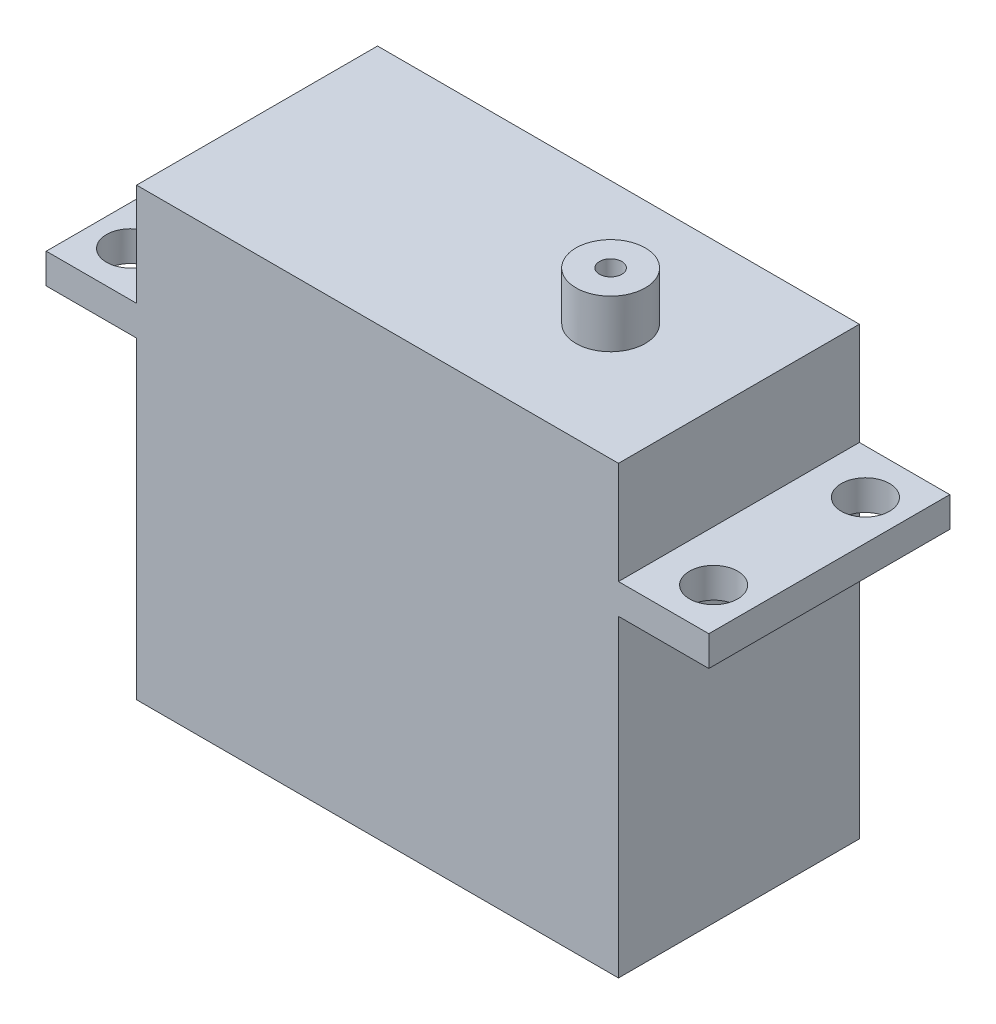
ISO-10303-21;
HEADER;
FILE_DESCRIPTION(('STEP AP214'),'2;1');
FILE_NAME('part.step','',(''),(''),'','','');
FILE_SCHEMA(('AUTOMOTIVE_DESIGN { 1 0 10303 214 1 1 1 1 }'));
ENDSEC;
DATA;
#1=APPLICATION_CONTEXT('core data for automotive mechanical design processes');
#2=APPLICATION_PROTOCOL_DEFINITION('international standard','automotive_design',2000,#1);
#3=PRODUCT_CONTEXT('',#1,'mechanical');
#4=PRODUCT('Part','Part','',(#3));
#5=PRODUCT_RELATED_PRODUCT_CATEGORY('part','',(#4));
#6=PRODUCT_DEFINITION_FORMATION('','',#4);
#7=PRODUCT_DEFINITION_CONTEXT('part definition',#1,'design');
#8=PRODUCT_DEFINITION('design','',#6,#7);
#9=PRODUCT_DEFINITION_SHAPE('','',#8);
#10=(LENGTH_UNIT() NAMED_UNIT(*) SI_UNIT(.MILLI.,.METRE.));
#11=(NAMED_UNIT(*) PLANE_ANGLE_UNIT() SI_UNIT($,.RADIAN.));
#12=(NAMED_UNIT(*) SI_UNIT($,.STERADIAN.) SOLID_ANGLE_UNIT());
#13=UNCERTAINTY_MEASURE_WITH_UNIT(LENGTH_MEASURE(1.E-05),#10,'distance_accuracy_value','');
#14=(GEOMETRIC_REPRESENTATION_CONTEXT(3) GLOBAL_UNCERTAINTY_ASSIGNED_CONTEXT((#13)) GLOBAL_UNIT_ASSIGNED_CONTEXT((#10,
#11,#12)) REPRESENTATION_CONTEXT('',''));
#15=CARTESIAN_POINT('',(0.,0.,0.));
#16=DIRECTION('',(0.,0.,1.));
#17=DIRECTION('',(1.,0.,0.));
#18=AXIS2_PLACEMENT_3D('',#15,#16,#17);
#19=CARTESIAN_POINT('',(-20.,37.,10.));
#20=DIRECTION('',(1.,0.,0.));
#21=DIRECTION('',(0.,0.,-1.));
#22=AXIS2_PLACEMENT_3D('',#19,#20,#21);
#23=PLANE('',#22);
#24=DIRECTION('',(0.,0.,-1.));
#25=VECTOR('',#24,1.);
#26=CARTESIAN_POINT('',(-20.,28.5,-10.));
#27=LINE('',#26,#25);
#28=CARTESIAN_POINT('',(-20.,28.5,10.));
#29=VERTEX_POINT('',#28);
#30=CARTESIAN_POINT('',(-20.,28.5,-10.));
#31=VERTEX_POINT('',#30);
#32=EDGE_CURVE('E176',#29,#31,#27,.T.);
#33=ORIENTED_EDGE('',*,*,#32,.F.);
#34=DIRECTION('',(0.,-1.,0.));
#35=VECTOR('',#34,1.);
#36=CARTESIAN_POINT('',(-20.,37.,10.));
#37=LINE('',#36,#35);
#38=CARTESIAN_POINT('',(-20.,37.,10.));
#39=VERTEX_POINT('',#38);
#40=EDGE_CURVE('E276',#39,#29,#37,.T.);
#41=ORIENTED_EDGE('',*,*,#40,.F.);
#42=DIRECTION('',(0.,0.,1.));
#43=VECTOR('',#42,1.);
#44=CARTESIAN_POINT('',(-20.,37.,10.));
#45=LINE('',#44,#43);
#46=CARTESIAN_POINT('',(-20.,37.,-10.));
#47=VERTEX_POINT('',#46);
#48=EDGE_CURVE('E253',#47,#39,#45,.T.);
#49=ORIENTED_EDGE('',*,*,#48,.F.);
#50=DIRECTION('',(0.,-1.,0.));
#51=VECTOR('',#50,1.);
#52=CARTESIAN_POINT('',(-20.,37.,-10.));
#53=LINE('',#52,#51);
#54=EDGE_CURVE('E281',#47,#31,#53,.T.);
#55=ORIENTED_EDGE('',*,*,#54,.T.);
#56=EDGE_LOOP('',(#33,#41,#49,#55));
#57=FACE_BOUND('',#56,.T.);
#58=ADVANCED_FACE('F39',(#57),#23,.F.);
#59=CARTESIAN_POINT('',(20.,37.,10.));
#60=DIRECTION('',(-1.,0.,0.));
#61=DIRECTION('',(0.,0.,1.));
#62=AXIS2_PLACEMENT_3D('',#59,#60,#61);
#63=PLANE('',#62);
#64=DIRECTION('',(0.,0.,1.));
#65=VECTOR('',#64,1.);
#66=CARTESIAN_POINT('',(20.,28.5,-10.));
#67=LINE('',#66,#65);
#68=CARTESIAN_POINT('',(20.,28.5,-10.));
#69=VERTEX_POINT('',#68);
#70=CARTESIAN_POINT('',(20.,28.5,10.));
#71=VERTEX_POINT('',#70);
#72=EDGE_CURVE('E210',#69,#71,#67,.T.);
#73=ORIENTED_EDGE('',*,*,#72,.F.);
#74=DIRECTION('',(0.,-1.,0.));
#75=VECTOR('',#74,1.);
#76=CARTESIAN_POINT('',(20.,37.,-10.));
#77=LINE('',#76,#75);
#78=CARTESIAN_POINT('',(20.,37.,-10.));
#79=VERTEX_POINT('',#78);
#80=EDGE_CURVE('E48',#79,#69,#77,.T.);
#81=ORIENTED_EDGE('',*,*,#80,.F.);
#82=DIRECTION('',(0.,0.,-1.));
#83=VECTOR('',#82,1.);
#84=CARTESIAN_POINT('',(20.,37.,10.));
#85=LINE('',#84,#83);
#86=CARTESIAN_POINT('',(20.,37.,10.));
#87=VERTEX_POINT('',#86);
#88=EDGE_CURVE('E245',#87,#79,#85,.T.);
#89=ORIENTED_EDGE('',*,*,#88,.F.);
#90=DIRECTION('',(0.,-1.,0.));
#91=VECTOR('',#90,1.);
#92=CARTESIAN_POINT('',(20.,37.,10.));
#93=LINE('',#92,#91);
#94=EDGE_CURVE('E273',#87,#71,#93,.T.);
#95=ORIENTED_EDGE('',*,*,#94,.T.);
#96=EDGE_LOOP('',(#73,#81,#89,#95));
#97=FACE_BOUND('',#96,.T.);
#98=ADVANCED_FACE('F328',(#97),#63,.F.);
#99=CARTESIAN_POINT('',(20.,26.,-10.));
#100=VERTEX_POINT('',#99);
#101=CARTESIAN_POINT('',(20.,0.,-10.));
#102=VERTEX_POINT('',#101);
#103=EDGE_CURVE('E284',#100,#102,#77,.T.);
#104=ORIENTED_EDGE('',*,*,#103,.F.);
#105=DIRECTION('',(0.,0.,1.));
#106=VECTOR('',#105,1.);
#107=CARTESIAN_POINT('',(20.,26.,-10.));
#108=LINE('',#107,#106);
#109=CARTESIAN_POINT('',(20.,26.,10.));
#110=VERTEX_POINT('',#109);
#111=EDGE_CURVE('E209',#100,#110,#108,.T.);
#112=ORIENTED_EDGE('',*,*,#111,.T.);
#113=CARTESIAN_POINT('',(20.,0.,10.));
#114=VERTEX_POINT('',#113);
#115=EDGE_CURVE('E259',#110,#114,#93,.T.);
#116=ORIENTED_EDGE('',*,*,#115,.T.);
#117=DIRECTION('',(0.,0.,-1.));
#118=VECTOR('',#117,1.);
#119=CARTESIAN_POINT('',(20.,0.,10.));
#120=LINE('',#119,#118);
#121=EDGE_CURVE('E244',#114,#102,#120,.T.);
#122=ORIENTED_EDGE('',*,*,#121,.T.);
#123=EDGE_LOOP('',(#104,#112,#116,#122));
#124=FACE_BOUND('',#123,.T.);
#125=ADVANCED_FACE('F41',(#124),#63,.F.);
#126=CARTESIAN_POINT('',(-20.,37.,-10.));
#127=DIRECTION('',(0.,0.,1.));
#128=DIRECTION('',(1.,0.,0.));
#129=AXIS2_PLACEMENT_3D('',#126,#127,#128);
#130=PLANE('',#129);
#131=DIRECTION('',(-1.,0.,0.));
#132=VECTOR('',#131,1.);
#133=CARTESIAN_POINT('',(-20.,0.,-10.));
#134=LINE('',#133,#132);
#135=CARTESIAN_POINT('',(-20.,0.,-10.));
#136=VERTEX_POINT('',#135);
#137=EDGE_CURVE('E263',#102,#136,#134,.T.);
#138=ORIENTED_EDGE('',*,*,#137,.T.);
#139=CARTESIAN_POINT('',(-20.,26.,-10.));
#140=VERTEX_POINT('',#139);
#141=EDGE_CURVE('E280',#140,#136,#53,.T.);
#142=ORIENTED_EDGE('',*,*,#141,.F.);
#143=DIRECTION('',(-1.,0.,0.));
#144=VECTOR('',#143,1.);
#145=CARTESIAN_POINT('',(-20.,26.,-10.));
#146=LINE('',#145,#144);
#147=CARTESIAN_POINT('',(-27.5,26.,-10.));
#148=VERTEX_POINT('',#147);
#149=EDGE_CURVE('E194',#140,#148,#146,.T.);
#150=ORIENTED_EDGE('',*,*,#149,.T.);
#151=DIRECTION('',(0.,-1.,0.));
#152=VECTOR('',#151,1.);
#153=CARTESIAN_POINT('',(-27.5,28.5,-10.));
#154=LINE('',#153,#152);
#155=CARTESIAN_POINT('',(-27.5,28.5,-10.));
#156=VERTEX_POINT('',#155);
#157=EDGE_CURVE('E205',#156,#148,#154,.T.);
#158=ORIENTED_EDGE('',*,*,#157,.F.);
#159=DIRECTION('',(-1.,0.,0.));
#160=VECTOR('',#159,1.);
#161=CARTESIAN_POINT('',(-20.,28.5,-10.));
#162=LINE('',#161,#160);
#163=EDGE_CURVE('E180',#31,#156,#162,.T.);
#164=ORIENTED_EDGE('',*,*,#163,.F.);
#165=ORIENTED_EDGE('',*,*,#54,.F.);
#166=DIRECTION('',(-1.,0.,0.));
#167=VECTOR('',#166,1.);
#168=CARTESIAN_POINT('',(-20.,37.,-10.));
#169=LINE('',#168,#167);
#170=EDGE_CURVE('E249',#79,#47,#169,.T.);
#171=ORIENTED_EDGE('',*,*,#170,.F.);
#172=ORIENTED_EDGE('',*,*,#80,.T.);
#173=DIRECTION('',(-1.,0.,0.));
#174=VECTOR('',#173,1.);
#175=CARTESIAN_POINT('',(20.,28.5,-10.));
#176=LINE('',#175,#174);
#177=CARTESIAN_POINT('',(27.5,28.5,-10.));
#178=VERTEX_POINT('',#177);
#179=EDGE_CURVE('E221',#178,#69,#176,.T.);
#180=ORIENTED_EDGE('',*,*,#179,.F.);
#181=DIRECTION('',(0.,-1.,0.));
#182=VECTOR('',#181,1.);
#183=CARTESIAN_POINT('',(27.5,28.5,-10.));
#184=LINE('',#183,#182);
#185=CARTESIAN_POINT('',(27.5,26.,-10.));
#186=VERTEX_POINT('',#185);
#187=EDGE_CURVE('E225',#178,#186,#184,.T.);
#188=ORIENTED_EDGE('',*,*,#187,.T.);
#189=DIRECTION('',(-1.,0.,0.));
#190=VECTOR('',#189,1.);
#191=CARTESIAN_POINT('',(20.,26.,-10.));
#192=LINE('',#191,#190);
#193=EDGE_CURVE('E215',#186,#100,#192,.T.);
#194=ORIENTED_EDGE('',*,*,#193,.T.);
#195=ORIENTED_EDGE('',*,*,#103,.T.);
#196=EDGE_LOOP('',(#138,#142,#150,#158,#164,#165,#171,#172,#180,#188,#194,#195));
#197=FACE_BOUND('',#196,.T.);
#198=ADVANCED_FACE('F309',(#197),#130,.F.);
#199=CARTESIAN_POINT('',(-20.,26.,10.));
#200=VERTEX_POINT('',#199);
#201=CARTESIAN_POINT('',(-20.,0.,10.));
#202=VERTEX_POINT('',#201);
#203=EDGE_CURVE('E60',#200,#202,#37,.T.);
#204=ORIENTED_EDGE('',*,*,#203,.F.);
#205=DIRECTION('',(0.,0.,-1.));
#206=VECTOR('',#205,1.);
#207=CARTESIAN_POINT('',(-20.,26.,-10.));
#208=LINE('',#207,#206);
#209=EDGE_CURVE('E55',#200,#140,#208,.T.);
#210=ORIENTED_EDGE('',*,*,#209,.T.);
#211=ORIENTED_EDGE('',*,*,#141,.T.);
#212=DIRECTION('',(0.,0.,1.));
#213=VECTOR('',#212,1.);
#214=CARTESIAN_POINT('',(-20.,0.,10.));
#215=LINE('',#214,#213);
#216=EDGE_CURVE('E267',#136,#202,#215,.T.);
#217=ORIENTED_EDGE('',*,*,#216,.T.);
#218=EDGE_LOOP('',(#204,#210,#211,#217));
#219=FACE_BOUND('',#218,.T.);
#220=ADVANCED_FACE('F358',(#219),#23,.F.);
#221=CARTESIAN_POINT('',(-20.,37.,10.));
#222=DIRECTION('',(0.,0.,-1.));
#223=DIRECTION('',(-1.,0.,0.));
#224=AXIS2_PLACEMENT_3D('',#221,#222,#223);
#225=PLANE('',#224);
#226=DIRECTION('',(1.,0.,0.));
#227=VECTOR('',#226,1.);
#228=CARTESIAN_POINT('',(-20.,0.,10.));
#229=LINE('',#228,#227);
#230=EDGE_CURVE('E250',#202,#114,#229,.T.);
#231=ORIENTED_EDGE('',*,*,#230,.T.);
#232=ORIENTED_EDGE('',*,*,#115,.F.);
#233=DIRECTION('',(1.,0.,0.));
#234=VECTOR('',#233,1.);
#235=CARTESIAN_POINT('',(20.,26.,10.));
#236=LINE('',#235,#234);
#237=CARTESIAN_POINT('',(27.5,26.,10.));
#238=VERTEX_POINT('',#237);
#239=EDGE_CURVE('E228',#110,#238,#236,.T.);
#240=ORIENTED_EDGE('',*,*,#239,.T.);
#241=DIRECTION('',(0.,-1.,0.));
#242=VECTOR('',#241,1.);
#243=CARTESIAN_POINT('',(27.5,28.5,10.));
#244=LINE('',#243,#242);
#245=CARTESIAN_POINT('',(27.5,28.5,10.));
#246=VERTEX_POINT('',#245);
#247=EDGE_CURVE('E240',#246,#238,#244,.T.);
#248=ORIENTED_EDGE('',*,*,#247,.F.);
#249=DIRECTION('',(1.,0.,0.));
#250=VECTOR('',#249,1.);
#251=CARTESIAN_POINT('',(20.,28.5,10.));
#252=LINE('',#251,#250);
#253=EDGE_CURVE('E214',#71,#246,#252,.T.);
#254=ORIENTED_EDGE('',*,*,#253,.F.);
#255=ORIENTED_EDGE('',*,*,#94,.F.);
#256=DIRECTION('',(1.,0.,0.));
#257=VECTOR('',#256,1.);
#258=CARTESIAN_POINT('',(-20.,37.,10.));
#259=LINE('',#258,#257);
#260=EDGE_CURVE('E256',#39,#87,#259,.T.);
#261=ORIENTED_EDGE('',*,*,#260,.F.);
#262=ORIENTED_EDGE('',*,*,#40,.T.);
#263=DIRECTION('',(1.,0.,0.));
#264=VECTOR('',#263,1.);
#265=CARTESIAN_POINT('',(-20.,28.5,10.));
#266=LINE('',#265,#264);
#267=CARTESIAN_POINT('',(-27.5,28.5,10.));
#268=VERTEX_POINT('',#267);
#269=EDGE_CURVE('E187',#268,#29,#266,.T.);
#270=ORIENTED_EDGE('',*,*,#269,.F.);
#271=DIRECTION('',(0.,-1.,0.));
#272=VECTOR('',#271,1.);
#273=CARTESIAN_POINT('',(-27.5,28.5,10.));
#274=LINE('',#273,#272);
#275=CARTESIAN_POINT('',(-27.5,26.,10.));
#276=VERTEX_POINT('',#275);
#277=EDGE_CURVE('E191',#268,#276,#274,.T.);
#278=ORIENTED_EDGE('',*,*,#277,.T.);
#279=DIRECTION('',(1.,0.,0.));
#280=VECTOR('',#279,1.);
#281=CARTESIAN_POINT('',(-20.,26.,10.));
#282=LINE('',#281,#280);
#283=EDGE_CURVE('E181',#276,#200,#282,.T.);
#284=ORIENTED_EDGE('',*,*,#283,.T.);
#285=ORIENTED_EDGE('',*,*,#203,.T.);
#286=EDGE_LOOP('',(#231,#232,#240,#248,#254,#255,#261,#262,#270,#278,#284,#285));
#287=FACE_BOUND('',#286,.T.);
#288=ADVANCED_FACE('F347',(#287),#225,.F.);
#289=CARTESIAN_POINT('',(0.,37.,0.));
#290=DIRECTION('',(0.,-1.,0.));
#291=DIRECTION('',(0.,0.,-1.));
#292=AXIS2_PLACEMENT_3D('',#289,#290,#291);
#293=PLANE('',#292);
#294=CARTESIAN_POINT('',(9.62499999999999,37.,0.275000000000001));
#295=DIRECTION('',(0.,-1.,0.));
#296=DIRECTION('',(0.,0.,-1.));
#297=AXIS2_PLACEMENT_3D('',#294,#295,#296);
#298=CIRCLE('',#297,2.875);
#299=CARTESIAN_POINT('',(9.62499999999999,37.,-2.6));
#300=VERTEX_POINT('',#299);
#301=EDGE_CURVE('E11',#300,#300,#298,.F.);
#302=ORIENTED_EDGE('',*,*,#301,.F.);
#303=EDGE_LOOP('',(#302));
#304=FACE_BOUND('',#303,.T.);
#305=ORIENTED_EDGE('',*,*,#88,.T.);
#306=ORIENTED_EDGE('',*,*,#170,.T.);
#307=ORIENTED_EDGE('',*,*,#48,.T.);
#308=ORIENTED_EDGE('',*,*,#260,.T.);
#309=EDGE_LOOP('',(#305,#306,#307,#308));
#310=FACE_BOUND('',#309,.T.);
#311=ADVANCED_FACE('F323',(#304,#310),#293,.F.);
#312=CARTESIAN_POINT('',(0.,0.,0.));
#313=DIRECTION('',(0.,-1.,0.));
#314=DIRECTION('',(0.,0.,-1.));
#315=AXIS2_PLACEMENT_3D('',#312,#313,#314);
#316=PLANE('',#315);
#317=ORIENTED_EDGE('',*,*,#121,.F.);
#318=ORIENTED_EDGE('',*,*,#230,.F.);
#319=ORIENTED_EDGE('',*,*,#216,.F.);
#320=ORIENTED_EDGE('',*,*,#137,.F.);
#321=EDGE_LOOP('',(#317,#318,#319,#320));
#322=FACE_BOUND('',#321,.T.);
#323=ADVANCED_FACE('F357',(#322),#316,.T.);
#324=CARTESIAN_POINT('',(27.5,28.5,-10.));
#325=DIRECTION('',(-1.,0.,0.));
#326=DIRECTION('',(0.,0.,1.));
#327=AXIS2_PLACEMENT_3D('',#324,#325,#326);
#328=PLANE('',#327);
#329=DIRECTION('',(0.,0.,-1.));
#330=VECTOR('',#329,1.);
#331=CARTESIAN_POINT('',(27.5,26.,-10.));
#332=LINE('',#331,#330);
#333=EDGE_CURVE('E231',#238,#186,#332,.T.);
#334=ORIENTED_EDGE('',*,*,#333,.T.);
#335=ORIENTED_EDGE('',*,*,#187,.F.);
#336=DIRECTION('',(0.,0.,-1.));
#337=VECTOR('',#336,1.);
#338=CARTESIAN_POINT('',(27.5,28.5,-10.));
#339=LINE('',#338,#337);
#340=EDGE_CURVE('E218',#246,#178,#339,.T.);
#341=ORIENTED_EDGE('',*,*,#340,.F.);
#342=ORIENTED_EDGE('',*,*,#247,.T.);
#343=EDGE_LOOP('',(#334,#335,#341,#342));
#344=FACE_BOUND('',#343,.T.);
#345=ADVANCED_FACE('F337',(#344),#328,.F.);
#346=CARTESIAN_POINT('',(0.,28.5,0.));
#347=DIRECTION('',(0.,1.,0.));
#348=DIRECTION('',(0.,0.,1.));
#349=AXIS2_PLACEMENT_3D('',#346,#347,#348);
#350=PLANE('',#349);
#351=CARTESIAN_POINT('',(24.2,28.5,-6.3));
#352=DIRECTION('',(0.,1.,0.));
#353=DIRECTION('',(0.,0.,1.));
#354=AXIS2_PLACEMENT_3D('',#351,#352,#353);
#355=CIRCLE('',#354,2.);
#356=CARTESIAN_POINT('',(24.2,28.5,-4.3));
#357=VERTEX_POINT('',#356);
#358=EDGE_CURVE('E163',#357,#357,#355,.T.);
#359=ORIENTED_EDGE('',*,*,#358,.F.);
#360=EDGE_LOOP('',(#359));
#361=FACE_BOUND('',#360,.T.);
#362=CARTESIAN_POINT('',(24.2,28.5,6.3));
#363=DIRECTION('',(0.,1.,0.));
#364=DIRECTION('',(0.,0.,1.));
#365=AXIS2_PLACEMENT_3D('',#362,#363,#364);
#366=CIRCLE('',#365,2.);
#367=CARTESIAN_POINT('',(24.2,28.5,8.3));
#368=VERTEX_POINT('',#367);
#369=EDGE_CURVE('E171',#368,#368,#366,.T.);
#370=ORIENTED_EDGE('',*,*,#369,.F.);
#371=EDGE_LOOP('',(#370));
#372=FACE_BOUND('',#371,.T.);
#373=ORIENTED_EDGE('',*,*,#72,.T.);
#374=ORIENTED_EDGE('',*,*,#253,.T.);
#375=ORIENTED_EDGE('',*,*,#340,.T.);
#376=ORIENTED_EDGE('',*,*,#179,.T.);
#377=EDGE_LOOP('',(#373,#374,#375,#376));
#378=FACE_BOUND('',#377,.T.);
#379=ADVANCED_FACE('F331',(#361,#372,#378),#350,.T.);
#380=CARTESIAN_POINT('',(0.,26.,0.));
#381=DIRECTION('',(0.,1.,0.));
#382=DIRECTION('',(0.,0.,1.));
#383=AXIS2_PLACEMENT_3D('',#380,#381,#382);
#384=PLANE('',#383);
#385=CARTESIAN_POINT('',(24.2,26.,-6.3));
#386=DIRECTION('',(0.,1.,0.));
#387=DIRECTION('',(0.,0.,1.));
#388=AXIS2_PLACEMENT_3D('',#385,#386,#387);
#389=CIRCLE('',#388,2.);
#390=CARTESIAN_POINT('',(24.2,26.,-4.3));
#391=VERTEX_POINT('',#390);
#392=EDGE_CURVE('E167',#391,#391,#389,.T.);
#393=ORIENTED_EDGE('',*,*,#392,.T.);
#394=EDGE_LOOP('',(#393));
#395=FACE_BOUND('',#394,.T.);
#396=CARTESIAN_POINT('',(24.2,26.,6.3));
#397=DIRECTION('',(0.,1.,0.));
#398=DIRECTION('',(0.,0.,1.));
#399=AXIS2_PLACEMENT_3D('',#396,#397,#398);
#400=CIRCLE('',#399,2.);
#401=CARTESIAN_POINT('',(24.2,26.,8.3));
#402=VERTEX_POINT('',#401);
#403=EDGE_CURVE('E175',#402,#402,#400,.T.);
#404=ORIENTED_EDGE('',*,*,#403,.T.);
#405=EDGE_LOOP('',(#404));
#406=FACE_BOUND('',#405,.T.);
#407=ORIENTED_EDGE('',*,*,#111,.F.);
#408=ORIENTED_EDGE('',*,*,#193,.F.);
#409=ORIENTED_EDGE('',*,*,#333,.F.);
#410=ORIENTED_EDGE('',*,*,#239,.F.);
#411=EDGE_LOOP('',(#407,#408,#409,#410));
#412=FACE_BOUND('',#411,.T.);
#413=ADVANCED_FACE('F342',(#395,#406,#412),#384,.F.);
#414=CARTESIAN_POINT('',(-27.5,28.5,-10.));
#415=DIRECTION('',(1.,0.,0.));
#416=DIRECTION('',(0.,0.,-1.));
#417=AXIS2_PLACEMENT_3D('',#414,#415,#416);
#418=PLANE('',#417);
#419=DIRECTION('',(0.,0.,1.));
#420=VECTOR('',#419,1.);
#421=CARTESIAN_POINT('',(-27.5,26.,-10.));
#422=LINE('',#421,#420);
#423=EDGE_CURVE('E197',#148,#276,#422,.T.);
#424=ORIENTED_EDGE('',*,*,#423,.T.);
#425=ORIENTED_EDGE('',*,*,#277,.F.);
#426=DIRECTION('',(0.,0.,1.));
#427=VECTOR('',#426,1.);
#428=CARTESIAN_POINT('',(-27.5,28.5,-10.));
#429=LINE('',#428,#427);
#430=EDGE_CURVE('E184',#156,#268,#429,.T.);
#431=ORIENTED_EDGE('',*,*,#430,.F.);
#432=ORIENTED_EDGE('',*,*,#157,.T.);
#433=EDGE_LOOP('',(#424,#425,#431,#432));
#434=FACE_BOUND('',#433,.T.);
#435=ADVANCED_FACE('F313',(#434),#418,.F.);
#436=CARTESIAN_POINT('',(0.,28.5,0.));
#437=DIRECTION('',(0.,-1.,0.));
#438=DIRECTION('',(0.,0.,-1.));
#439=AXIS2_PLACEMENT_3D('',#436,#437,#438);
#440=PLANE('',#439);
#441=CARTESIAN_POINT('',(-24.2,28.5,6.3));
#442=DIRECTION('',(0.,1.,0.));
#443=DIRECTION('',(0.,0.,1.));
#444=AXIS2_PLACEMENT_3D('',#441,#442,#443);
#445=CIRCLE('',#444,2.);
#446=CARTESIAN_POINT('',(-24.2,28.5,8.3));
#447=VERTEX_POINT('',#446);
#448=EDGE_CURVE('E146',#447,#447,#445,.T.);
#449=ORIENTED_EDGE('',*,*,#448,.F.);
#450=EDGE_LOOP('',(#449));
#451=FACE_BOUND('',#450,.T.);
#452=CARTESIAN_POINT('',(-24.2,28.5,-6.3));
#453=DIRECTION('',(0.,1.,0.));
#454=DIRECTION('',(0.,0.,1.));
#455=AXIS2_PLACEMENT_3D('',#452,#453,#454);
#456=CIRCLE('',#455,2.);
#457=CARTESIAN_POINT('',(-24.2,28.5,-4.3));
#458=VERTEX_POINT('',#457);
#459=EDGE_CURVE('E158',#458,#458,#456,.T.);
#460=ORIENTED_EDGE('',*,*,#459,.F.);
#461=EDGE_LOOP('',(#460));
#462=FACE_BOUND('',#461,.T.);
#463=ORIENTED_EDGE('',*,*,#32,.T.);
#464=ORIENTED_EDGE('',*,*,#163,.T.);
#465=ORIENTED_EDGE('',*,*,#430,.T.);
#466=ORIENTED_EDGE('',*,*,#269,.T.);
#467=EDGE_LOOP('',(#463,#464,#465,#466));
#468=FACE_BOUND('',#467,.T.);
#469=ADVANCED_FACE('F301',(#451,#462,#468),#440,.F.);
#470=CARTESIAN_POINT('',(0.,26.,0.));
#471=DIRECTION('',(0.,-1.,0.));
#472=DIRECTION('',(0.,0.,-1.));
#473=AXIS2_PLACEMENT_3D('',#470,#471,#472);
#474=PLANE('',#473);
#475=CARTESIAN_POINT('',(-24.2,26.,6.3));
#476=DIRECTION('',(0.,-1.,0.));
#477=DIRECTION('',(0.,0.,-1.));
#478=AXIS2_PLACEMENT_3D('',#475,#476,#477);
#479=CIRCLE('',#478,2.);
#480=CARTESIAN_POINT('',(-24.2,26.,4.3));
#481=VERTEX_POINT('',#480);
#482=EDGE_CURVE('E154',#481,#481,#479,.T.);
#483=ORIENTED_EDGE('',*,*,#482,.F.);
#484=EDGE_LOOP('',(#483));
#485=FACE_BOUND('',#484,.T.);
#486=CARTESIAN_POINT('',(-24.2,26.,-6.3));
#487=DIRECTION('',(0.,-1.,0.));
#488=DIRECTION('',(0.,0.,-1.));
#489=AXIS2_PLACEMENT_3D('',#486,#487,#488);
#490=CIRCLE('',#489,2.);
#491=CARTESIAN_POINT('',(-24.2,26.,-8.3));
#492=VERTEX_POINT('',#491);
#493=EDGE_CURVE('E162',#492,#492,#490,.T.);
#494=ORIENTED_EDGE('',*,*,#493,.F.);
#495=EDGE_LOOP('',(#494));
#496=FACE_BOUND('',#495,.T.);
#497=ORIENTED_EDGE('',*,*,#209,.F.);
#498=ORIENTED_EDGE('',*,*,#283,.F.);
#499=ORIENTED_EDGE('',*,*,#423,.F.);
#500=ORIENTED_EDGE('',*,*,#149,.F.);
#501=EDGE_LOOP('',(#497,#498,#499,#500));
#502=FACE_BOUND('',#501,.T.);
#503=ADVANCED_FACE('F297',(#485,#496,#502),#474,.T.);
#504=CARTESIAN_POINT('',(24.2,28.5,6.3));
#505=DIRECTION('',(0.,1.,0.));
#506=DIRECTION('',(0.,0.,1.));
#507=AXIS2_PLACEMENT_3D('',#504,#505,#506);
#508=CYLINDRICAL_SURFACE('',#507,2.);
#509=ORIENTED_EDGE('',*,*,#369,.T.);
#510=EDGE_LOOP('',(#509));
#511=FACE_BOUND('',#510,.T.);
#512=ORIENTED_EDGE('',*,*,#403,.F.);
#513=EDGE_LOOP('',(#512));
#514=FACE_BOUND('',#513,.T.);
#515=ADVANCED_FACE('F300',(#511,#514),#508,.F.);
#516=CARTESIAN_POINT('',(24.2,28.5,-6.3));
#517=DIRECTION('',(0.,1.,0.));
#518=DIRECTION('',(0.,0.,1.));
#519=AXIS2_PLACEMENT_3D('',#516,#517,#518);
#520=CYLINDRICAL_SURFACE('',#519,2.);
#521=ORIENTED_EDGE('',*,*,#358,.T.);
#522=EDGE_LOOP('',(#521));
#523=FACE_BOUND('',#522,.T.);
#524=ORIENTED_EDGE('',*,*,#392,.F.);
#525=EDGE_LOOP('',(#524));
#526=FACE_BOUND('',#525,.T.);
#527=ADVANCED_FACE('F453',(#523,#526),#520,.F.);
#528=CARTESIAN_POINT('',(-24.2,28.5,-6.3));
#529=DIRECTION('',(0.,1.,0.));
#530=DIRECTION('',(0.,0.,1.));
#531=AXIS2_PLACEMENT_3D('',#528,#529,#530);
#532=CYLINDRICAL_SURFACE('',#531,2.);
#533=ORIENTED_EDGE('',*,*,#493,.T.);
#534=EDGE_LOOP('',(#533));
#535=FACE_BOUND('',#534,.T.);
#536=ORIENTED_EDGE('',*,*,#459,.T.);
#537=EDGE_LOOP('',(#536));
#538=FACE_BOUND('',#537,.T.);
#539=ADVANCED_FACE('F294',(#535,#538),#532,.F.);
#540=CARTESIAN_POINT('',(-24.2,28.5,6.3));
#541=DIRECTION('',(0.,1.,0.));
#542=DIRECTION('',(0.,0.,1.));
#543=AXIS2_PLACEMENT_3D('',#540,#541,#542);
#544=CYLINDRICAL_SURFACE('',#543,2.);
#545=ORIENTED_EDGE('',*,*,#482,.T.);
#546=EDGE_LOOP('',(#545));
#547=FACE_BOUND('',#546,.T.);
#548=ORIENTED_EDGE('',*,*,#448,.T.);
#549=EDGE_LOOP('',(#548));
#550=FACE_BOUND('',#549,.T.);
#551=ADVANCED_FACE('F472',(#547,#550),#544,.F.);
#552=CARTESIAN_POINT('',(9.62499999999999,41.,0.275000000000001));
#553=DIRECTION('',(0.,-1.,0.));
#554=DIRECTION('',(0.,0.,-1.));
#555=AXIS2_PLACEMENT_3D('',#552,#553,#554);
#556=CYLINDRICAL_SURFACE('',#555,2.875);
#557=CARTESIAN_POINT('',(9.62499999999999,41.,0.275000000000001));
#558=DIRECTION('',(0.,1.,0.));
#559=DIRECTION('',(0.,0.,1.));
#560=AXIS2_PLACEMENT_3D('',#557,#558,#559);
#561=CIRCLE('',#560,2.875);
#562=CARTESIAN_POINT('',(9.62499999999999,41.,3.15));
#563=VERTEX_POINT('',#562);
#564=EDGE_CURVE('E140',#563,#563,#561,.T.);
#565=ORIENTED_EDGE('',*,*,#564,.F.);
#566=EDGE_LOOP('',(#565));
#567=FACE_BOUND('',#566,.T.);
#568=ORIENTED_EDGE('',*,*,#301,.T.);
#569=EDGE_LOOP('',(#568));
#570=FACE_BOUND('',#569,.T.);
#571=ADVANCED_FACE('F481',(#567,#570),#556,.T.);
#572=CARTESIAN_POINT('',(9.62499999999999,41.,0.275000000000001));
#573=DIRECTION('',(0.,1.,0.));
#574=DIRECTION('',(0.,0.,1.));
#575=AXIS2_PLACEMENT_3D('',#572,#573,#574);
#576=PLANE('',#575);
#577=CARTESIAN_POINT('',(9.62499999999999,41.,0.275000000000001));
#578=DIRECTION('',(0.,1.,0.));
#579=DIRECTION('',(0.,0.,1.));
#580=AXIS2_PLACEMENT_3D('',#577,#578,#579);
#581=CIRCLE('',#580,0.924999999999999);
#582=CARTESIAN_POINT('',(9.62499999999999,41.,1.2));
#583=VERTEX_POINT('',#582);
#584=EDGE_CURVE('E141',#583,#583,#581,.T.);
#585=ORIENTED_EDGE('',*,*,#584,.F.);
#586=EDGE_LOOP('',(#585));
#587=FACE_BOUND('',#586,.T.);
#588=ORIENTED_EDGE('',*,*,#564,.T.);
#589=EDGE_LOOP('',(#588));
#590=FACE_BOUND('',#589,.T.);
#591=ADVANCED_FACE('F133',(#587,#590),#576,.T.);
#592=CARTESIAN_POINT('',(9.62499999999999,37.,0.275000000000001));
#593=DIRECTION('',(0.,1.,0.));
#594=DIRECTION('',(0.,0.,1.));
#595=AXIS2_PLACEMENT_3D('',#592,#593,#594);
#596=CONICAL_SURFACE('',#595,0.924999999999999,1.02974425867665);
#597=CARTESIAN_POINT('',(9.62499999999999,36.4442039273995,0.275000000000001));
#598=VERTEX_POINT('',#597);
#599=VERTEX_LOOP('',#598);
#600=FACE_BOUND('',#599,.T.);
#601=CARTESIAN_POINT('',(9.62499999999999,37.,0.275000000000001));
#602=DIRECTION('',(0.,1.,0.));
#603=DIRECTION('',(0.,0.,1.));
#604=AXIS2_PLACEMENT_3D('',#601,#602,#603);
#605=CIRCLE('',#604,0.924999999999999);
#606=CARTESIAN_POINT('',(9.62499999999999,37.,1.2));
#607=VERTEX_POINT('',#606);
#608=EDGE_CURVE('E137',#607,#607,#605,.T.);
#609=ORIENTED_EDGE('',*,*,#608,.T.);
#610=EDGE_LOOP('',(#609));
#611=FACE_BOUND('',#610,.T.);
#612=ADVANCED_FACE('F129',(#600,#611),#596,.F.);
#613=CARTESIAN_POINT('',(9.62499999999999,41.,0.275000000000001));
#614=DIRECTION('',(0.,1.,0.));
#615=DIRECTION('',(0.,0.,1.));
#616=AXIS2_PLACEMENT_3D('',#613,#614,#615);
#617=CYLINDRICAL_SURFACE('',#616,0.924999999999999);
#618=ORIENTED_EDGE('',*,*,#608,.F.);
#619=EDGE_LOOP('',(#618));
#620=FACE_BOUND('',#619,.T.);
#621=ORIENTED_EDGE('',*,*,#584,.T.);
#622=EDGE_LOOP('',(#621));
#623=FACE_BOUND('',#622,.T.);
#624=ADVANCED_FACE('F132',(#620,#623),#617,.F.);
#625=CLOSED_SHELL('',(#58,#98,#125,#198,#220,#288,#311,#323,#345,#379,#413,#435,#469,#503,#515,
#527,#539,#551,#571,#591,#612,#624));
#626=MANIFOLD_SOLID_BREP('B2',#625);
#627=ADVANCED_BREP_SHAPE_REPRESENTATION('',(#18,#626),#14);
#628=SHAPE_DEFINITION_REPRESENTATION(#9,#627);
ENDSEC;
END-ISO-10303-21;
